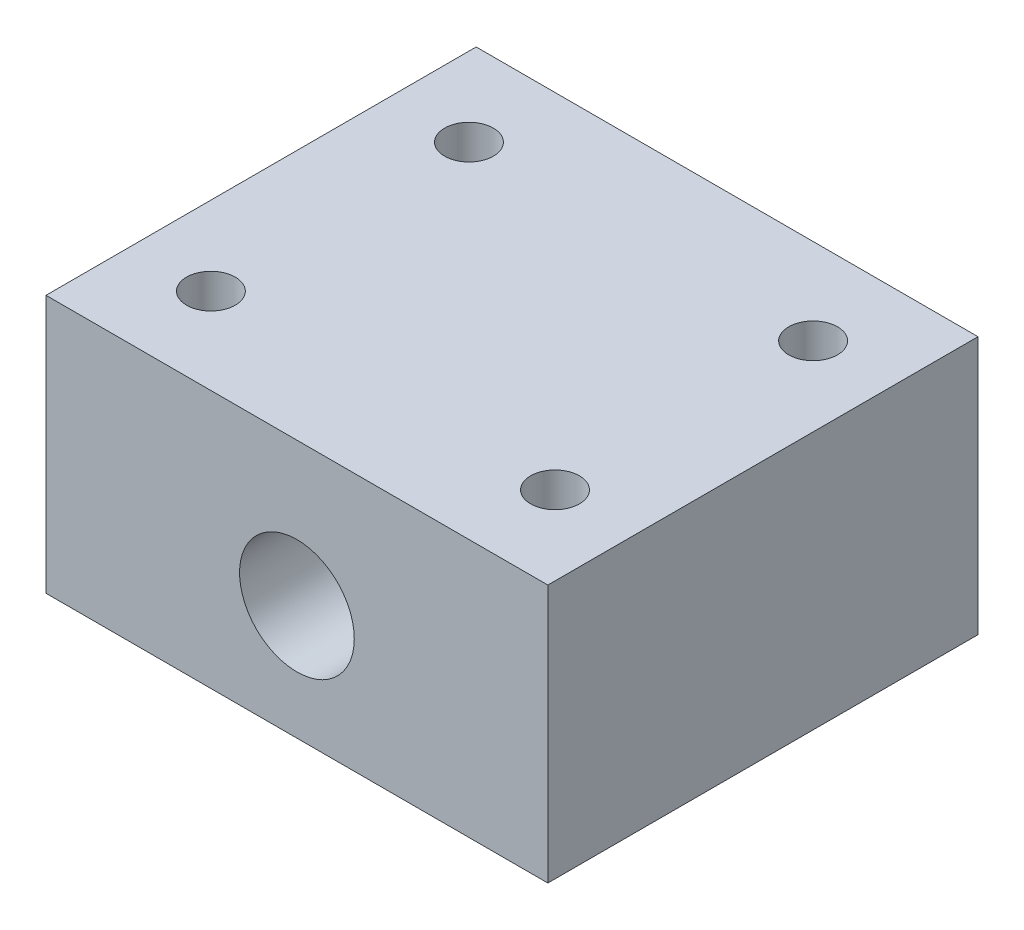
ISO-10303-21;
HEADER;
FILE_DESCRIPTION(('STEP AP214'),'2;1');
FILE_NAME('part.step','',(''),(''),'','','');
FILE_SCHEMA(('AUTOMOTIVE_DESIGN { 1 0 10303 214 1 1 1 1 }'));
ENDSEC;
DATA;
#1=APPLICATION_CONTEXT('core data for automotive mechanical design processes');
#2=APPLICATION_PROTOCOL_DEFINITION('international standard','automotive_design',2000,#1);
#3=PRODUCT_CONTEXT('',#1,'mechanical');
#4=PRODUCT('Part','Part','',(#3));
#5=PRODUCT_RELATED_PRODUCT_CATEGORY('part','',(#4));
#6=PRODUCT_DEFINITION_FORMATION('','',#4);
#7=PRODUCT_DEFINITION_CONTEXT('part definition',#1,'design');
#8=PRODUCT_DEFINITION('design','',#6,#7);
#9=PRODUCT_DEFINITION_SHAPE('','',#8);
#10=(LENGTH_UNIT() NAMED_UNIT(*) SI_UNIT(.MILLI.,.METRE.));
#11=(NAMED_UNIT(*) PLANE_ANGLE_UNIT() SI_UNIT($,.RADIAN.));
#12=(NAMED_UNIT(*) SI_UNIT($,.STERADIAN.) SOLID_ANGLE_UNIT());
#13=UNCERTAINTY_MEASURE_WITH_UNIT(LENGTH_MEASURE(1.E-05),#10,'distance_accuracy_value','');
#14=(GEOMETRIC_REPRESENTATION_CONTEXT(3) GLOBAL_UNCERTAINTY_ASSIGNED_CONTEXT((#13)) GLOBAL_UNIT_ASSIGNED_CONTEXT((#10,
#11,#12)) REPRESENTATION_CONTEXT('',''));
#15=CARTESIAN_POINT('',(0.,0.,0.));
#16=DIRECTION('',(0.,0.,1.));
#17=DIRECTION('',(1.,0.,0.));
#18=AXIS2_PLACEMENT_3D('',#15,#16,#17);
#19=CARTESIAN_POINT('',(0.,18.,0.));
#20=DIRECTION('',(1.,0.,0.));
#21=DIRECTION('',(0.,0.,-1.));
#22=AXIS2_PLACEMENT_3D('',#19,#20,#21);
#23=PLANE('',#22);
#24=DIRECTION('',(0.,0.,1.));
#25=VECTOR('',#24,1.);
#26=CARTESIAN_POINT('',(0.,0.,0.));
#27=LINE('',#26,#25);
#28=CARTESIAN_POINT('',(0.,0.,-30.));
#29=VERTEX_POINT('',#28);
#30=CARTESIAN_POINT('',(0.,0.,0.));
#31=VERTEX_POINT('',#30);
#32=EDGE_CURVE('E96',#29,#31,#27,.T.);
#33=ORIENTED_EDGE('',*,*,#32,.T.);
#34=DIRECTION('',(0.,-1.,0.));
#35=VECTOR('',#34,1.);
#36=CARTESIAN_POINT('',(0.,18.,0.));
#37=LINE('',#36,#35);
#38=CARTESIAN_POINT('',(0.,18.,0.));
#39=VERTEX_POINT('',#38);
#40=EDGE_CURVE('E11',#39,#31,#37,.T.);
#41=ORIENTED_EDGE('',*,*,#40,.F.);
#42=DIRECTION('',(0.,0.,1.));
#43=VECTOR('',#42,1.);
#44=CARTESIAN_POINT('',(0.,18.,0.));
#45=LINE('',#44,#43);
#46=CARTESIAN_POINT('',(0.,18.,-30.));
#47=VERTEX_POINT('',#46);
#48=EDGE_CURVE('E84',#47,#39,#45,.T.);
#49=ORIENTED_EDGE('',*,*,#48,.F.);
#50=DIRECTION('',(0.,-1.,0.));
#51=VECTOR('',#50,1.);
#52=CARTESIAN_POINT('',(0.,18.,-30.));
#53=LINE('',#52,#51);
#54=EDGE_CURVE('E92',#47,#29,#53,.T.);
#55=ORIENTED_EDGE('',*,*,#54,.T.);
#56=EDGE_LOOP('',(#33,#41,#49,#55));
#57=FACE_BOUND('',#56,.T.);
#58=ADVANCED_FACE('F33',(#57),#23,.F.);
#59=CARTESIAN_POINT('',(0.,18.,0.));
#60=DIRECTION('',(0.,0.,-1.));
#61=DIRECTION('',(-1.,0.,0.));
#62=AXIS2_PLACEMENT_3D('',#59,#60,#61);
#63=PLANE('',#62);
#64=CARTESIAN_POINT('',(17.5,8.,0.));
#65=DIRECTION('',(0.,0.,1.));
#66=DIRECTION('',(1.,0.,0.));
#67=AXIS2_PLACEMENT_3D('',#64,#65,#66);
#68=CIRCLE('',#67,4.);
#69=CARTESIAN_POINT('',(21.5,8.,0.));
#70=VERTEX_POINT('',#69);
#71=EDGE_CURVE('E134',#70,#70,#68,.T.);
#72=ORIENTED_EDGE('',*,*,#71,.F.);
#73=EDGE_LOOP('',(#72));
#74=FACE_BOUND('',#73,.T.);
#75=DIRECTION('',(1.,0.,0.));
#76=VECTOR('',#75,1.);
#77=CARTESIAN_POINT('',(0.,0.,0.));
#78=LINE('',#77,#76);
#79=CARTESIAN_POINT('',(35.,0.,0.));
#80=VERTEX_POINT('',#79);
#81=EDGE_CURVE('E88',#31,#80,#78,.T.);
#82=ORIENTED_EDGE('',*,*,#81,.T.);
#83=DIRECTION('',(0.,-1.,0.));
#84=VECTOR('',#83,1.);
#85=CARTESIAN_POINT('',(35.,18.,0.));
#86=LINE('',#85,#84);
#87=CARTESIAN_POINT('',(35.,18.,0.));
#88=VERTEX_POINT('',#87);
#89=EDGE_CURVE('E41',#88,#80,#86,.T.);
#90=ORIENTED_EDGE('',*,*,#89,.F.);
#91=DIRECTION('',(1.,0.,0.));
#92=VECTOR('',#91,1.);
#93=CARTESIAN_POINT('',(0.,18.,0.));
#94=LINE('',#93,#92);
#95=EDGE_CURVE('E79',#39,#88,#94,.T.);
#96=ORIENTED_EDGE('',*,*,#95,.F.);
#97=ORIENTED_EDGE('',*,*,#40,.T.);
#98=EDGE_LOOP('',(#82,#90,#96,#97));
#99=FACE_BOUND('',#98,.T.);
#100=ADVANCED_FACE('F87',(#74,#99),#63,.F.);
#101=CARTESIAN_POINT('',(35.,18.,0.));
#102=DIRECTION('',(-1.,0.,0.));
#103=DIRECTION('',(0.,0.,1.));
#104=AXIS2_PLACEMENT_3D('',#101,#102,#103);
#105=PLANE('',#104);
#106=DIRECTION('',(0.,0.,-1.));
#107=VECTOR('',#106,1.);
#108=CARTESIAN_POINT('',(35.,0.,0.));
#109=LINE('',#108,#107);
#110=CARTESIAN_POINT('',(35.,0.,-30.));
#111=VERTEX_POINT('',#110);
#112=EDGE_CURVE('E66',#80,#111,#109,.T.);
#113=ORIENTED_EDGE('',*,*,#112,.T.);
#114=DIRECTION('',(0.,-1.,0.));
#115=VECTOR('',#114,1.);
#116=CARTESIAN_POINT('',(35.,18.,-30.));
#117=LINE('',#116,#115);
#118=CARTESIAN_POINT('',(35.,18.,-30.));
#119=VERTEX_POINT('',#118);
#120=EDGE_CURVE('E89',#119,#111,#117,.T.);
#121=ORIENTED_EDGE('',*,*,#120,.F.);
#122=DIRECTION('',(0.,0.,-1.));
#123=VECTOR('',#122,1.);
#124=CARTESIAN_POINT('',(35.,18.,0.));
#125=LINE('',#124,#123);
#126=EDGE_CURVE('E82',#88,#119,#125,.T.);
#127=ORIENTED_EDGE('',*,*,#126,.F.);
#128=ORIENTED_EDGE('',*,*,#89,.T.);
#129=EDGE_LOOP('',(#113,#121,#127,#128));
#130=FACE_BOUND('',#129,.T.);
#131=ADVANCED_FACE('F90',(#130),#105,.F.);
#132=CARTESIAN_POINT('',(0.,18.,-30.));
#133=DIRECTION('',(0.,0.,1.));
#134=DIRECTION('',(1.,0.,0.));
#135=AXIS2_PLACEMENT_3D('',#132,#133,#134);
#136=PLANE('',#135);
#137=CARTESIAN_POINT('',(17.5,8.,-30.));
#138=DIRECTION('',(0.,0.,1.));
#139=DIRECTION('',(1.,0.,0.));
#140=AXIS2_PLACEMENT_3D('',#137,#138,#139);
#141=CIRCLE('',#140,4.);
#142=CARTESIAN_POINT('',(21.5,8.,-30.));
#143=VERTEX_POINT('',#142);
#144=EDGE_CURVE('E120',#143,#143,#141,.T.);
#145=ORIENTED_EDGE('',*,*,#144,.T.);
#146=EDGE_LOOP('',(#145));
#147=FACE_BOUND('',#146,.T.);
#148=DIRECTION('',(-1.,0.,0.));
#149=VECTOR('',#148,1.);
#150=CARTESIAN_POINT('',(0.,0.,-30.));
#151=LINE('',#150,#149);
#152=EDGE_CURVE('E72',#111,#29,#151,.T.);
#153=ORIENTED_EDGE('',*,*,#152,.T.);
#154=ORIENTED_EDGE('',*,*,#54,.F.);
#155=DIRECTION('',(-1.,0.,0.));
#156=VECTOR('',#155,1.);
#157=CARTESIAN_POINT('',(0.,18.,-30.));
#158=LINE('',#157,#156);
#159=EDGE_CURVE('E49',#119,#47,#158,.T.);
#160=ORIENTED_EDGE('',*,*,#159,.F.);
#161=ORIENTED_EDGE('',*,*,#120,.T.);
#162=EDGE_LOOP('',(#153,#154,#160,#161));
#163=FACE_BOUND('',#162,.T.);
#164=ADVANCED_FACE('F104',(#147,#163),#136,.F.);
#165=CARTESIAN_POINT('',(0.,18.,0.));
#166=DIRECTION('',(0.,-1.,0.));
#167=DIRECTION('',(0.,0.,-1.));
#168=AXIS2_PLACEMENT_3D('',#165,#166,#167);
#169=PLANE('',#168);
#170=CARTESIAN_POINT('',(5.49999999999999,18.,-6.));
#171=DIRECTION('',(0.,-1.,0.));
#172=DIRECTION('',(0.,0.,1.));
#173=AXIS2_PLACEMENT_3D('',#170,#171,#172);
#174=CIRCLE('',#173,1.7);
#175=CARTESIAN_POINT('',(5.49999999999999,18.,-4.3));
#176=VERTEX_POINT('',#175);
#177=EDGE_CURVE('E119',#176,#176,#174,.T.);
#178=ORIENTED_EDGE('',*,*,#177,.T.);
#179=EDGE_LOOP('',(#178));
#180=FACE_BOUND('',#179,.T.);
#181=CARTESIAN_POINT('',(29.5,18.,-5.99999999999999));
#182=DIRECTION('',(0.,-1.,0.));
#183=DIRECTION('',(0.,0.,-1.));
#184=AXIS2_PLACEMENT_3D('',#181,#182,#183);
#185=CIRCLE('',#184,1.7);
#186=CARTESIAN_POINT('',(29.5,18.,-7.69999999999999));
#187=VERTEX_POINT('',#186);
#188=EDGE_CURVE('E126',#187,#187,#185,.T.);
#189=ORIENTED_EDGE('',*,*,#188,.T.);
#190=EDGE_LOOP('',(#189));
#191=FACE_BOUND('',#190,.T.);
#192=CARTESIAN_POINT('',(29.5,18.,-24.));
#193=DIRECTION('',(0.,-1.,0.));
#194=DIRECTION('',(0.,0.,1.));
#195=AXIS2_PLACEMENT_3D('',#192,#193,#194);
#196=CIRCLE('',#195,1.7);
#197=CARTESIAN_POINT('',(29.5,18.,-22.3));
#198=VERTEX_POINT('',#197);
#199=EDGE_CURVE('E113',#198,#198,#196,.T.);
#200=ORIENTED_EDGE('',*,*,#199,.T.);
#201=EDGE_LOOP('',(#200));
#202=FACE_BOUND('',#201,.T.);
#203=CARTESIAN_POINT('',(5.49999999999999,18.,-24.));
#204=DIRECTION('',(0.,-1.,0.));
#205=DIRECTION('',(0.,0.,-1.));
#206=AXIS2_PLACEMENT_3D('',#203,#204,#205);
#207=CIRCLE('',#206,1.7);
#208=CARTESIAN_POINT('',(5.49999999999999,18.,-25.7));
#209=VERTEX_POINT('',#208);
#210=EDGE_CURVE('E99',#209,#209,#207,.T.);
#211=ORIENTED_EDGE('',*,*,#210,.T.);
#212=EDGE_LOOP('',(#211));
#213=FACE_BOUND('',#212,.T.);
#214=ORIENTED_EDGE('',*,*,#48,.T.);
#215=ORIENTED_EDGE('',*,*,#95,.T.);
#216=ORIENTED_EDGE('',*,*,#126,.T.);
#217=ORIENTED_EDGE('',*,*,#159,.T.);
#218=EDGE_LOOP('',(#214,#215,#216,#217));
#219=FACE_BOUND('',#218,.T.);
#220=ADVANCED_FACE('F80',(#180,#191,#202,#213,#219),#169,.F.);
#221=CARTESIAN_POINT('',(0.,0.,0.));
#222=DIRECTION('',(0.,-1.,0.));
#223=DIRECTION('',(0.,0.,-1.));
#224=AXIS2_PLACEMENT_3D('',#221,#222,#223);
#225=PLANE('',#224);
#226=CARTESIAN_POINT('',(5.49999999999999,0.,-6.));
#227=DIRECTION('',(0.,-1.,0.));
#228=DIRECTION('',(0.,0.,1.));
#229=AXIS2_PLACEMENT_3D('',#226,#227,#228);
#230=CIRCLE('',#229,1.7);
#231=CARTESIAN_POINT('',(5.49999999999999,0.,-4.3));
#232=VERTEX_POINT('',#231);
#233=EDGE_CURVE('E116',#232,#232,#230,.T.);
#234=ORIENTED_EDGE('',*,*,#233,.F.);
#235=EDGE_LOOP('',(#234));
#236=FACE_BOUND('',#235,.T.);
#237=CARTESIAN_POINT('',(29.5,0.,-5.99999999999999));
#238=DIRECTION('',(0.,-1.,0.));
#239=DIRECTION('',(0.,0.,-1.));
#240=AXIS2_PLACEMENT_3D('',#237,#238,#239);
#241=CIRCLE('',#240,1.7);
#242=CARTESIAN_POINT('',(29.5,0.,-7.69999999999999));
#243=VERTEX_POINT('',#242);
#244=EDGE_CURVE('E123',#243,#243,#241,.T.);
#245=ORIENTED_EDGE('',*,*,#244,.F.);
#246=EDGE_LOOP('',(#245));
#247=FACE_BOUND('',#246,.T.);
#248=CARTESIAN_POINT('',(29.5,0.,-24.));
#249=DIRECTION('',(0.,-1.,0.));
#250=DIRECTION('',(0.,0.,1.));
#251=AXIS2_PLACEMENT_3D('',#248,#249,#250);
#252=CIRCLE('',#251,1.7);
#253=CARTESIAN_POINT('',(29.5,0.,-22.3));
#254=VERTEX_POINT('',#253);
#255=EDGE_CURVE('E129',#254,#254,#252,.T.);
#256=ORIENTED_EDGE('',*,*,#255,.F.);
#257=EDGE_LOOP('',(#256));
#258=FACE_BOUND('',#257,.T.);
#259=CARTESIAN_POINT('',(5.49999999999999,0.,-24.));
#260=DIRECTION('',(0.,-1.,0.));
#261=DIRECTION('',(0.,0.,-1.));
#262=AXIS2_PLACEMENT_3D('',#259,#260,#261);
#263=CIRCLE('',#262,1.7);
#264=CARTESIAN_POINT('',(5.49999999999999,0.,-25.7));
#265=VERTEX_POINT('',#264);
#266=EDGE_CURVE('E110',#265,#265,#263,.T.);
#267=ORIENTED_EDGE('',*,*,#266,.F.);
#268=EDGE_LOOP('',(#267));
#269=FACE_BOUND('',#268,.T.);
#270=ORIENTED_EDGE('',*,*,#32,.F.);
#271=ORIENTED_EDGE('',*,*,#152,.F.);
#272=ORIENTED_EDGE('',*,*,#112,.F.);
#273=ORIENTED_EDGE('',*,*,#81,.F.);
#274=EDGE_LOOP('',(#270,#271,#272,#273));
#275=FACE_BOUND('',#274,.T.);
#276=ADVANCED_FACE('F107',(#236,#247,#258,#269,#275),#225,.T.);
#277=CARTESIAN_POINT('',(5.49999999999999,18.,-24.));
#278=DIRECTION('',(0.,-1.,0.));
#279=DIRECTION('',(0.,0.,-1.));
#280=AXIS2_PLACEMENT_3D('',#277,#278,#279);
#281=CYLINDRICAL_SURFACE('',#280,1.7);
#282=ORIENTED_EDGE('',*,*,#210,.F.);
#283=EDGE_LOOP('',(#282));
#284=FACE_BOUND('',#283,.T.);
#285=ORIENTED_EDGE('',*,*,#266,.T.);
#286=EDGE_LOOP('',(#285));
#287=FACE_BOUND('',#286,.T.);
#288=ADVANCED_FACE('F159',(#284,#287),#281,.F.);
#289=CARTESIAN_POINT('',(29.5,18.,-24.));
#290=DIRECTION('',(0.,-1.,0.));
#291=DIRECTION('',(0.,0.,-1.));
#292=AXIS2_PLACEMENT_3D('',#289,#290,#291);
#293=CYLINDRICAL_SURFACE('',#292,1.7);
#294=ORIENTED_EDGE('',*,*,#199,.F.);
#295=EDGE_LOOP('',(#294));
#296=FACE_BOUND('',#295,.T.);
#297=ORIENTED_EDGE('',*,*,#255,.T.);
#298=EDGE_LOOP('',(#297));
#299=FACE_BOUND('',#298,.T.);
#300=ADVANCED_FACE('F166',(#296,#299),#293,.F.);
#301=CARTESIAN_POINT('',(29.5,18.,-5.99999999999999));
#302=DIRECTION('',(0.,-1.,0.));
#303=DIRECTION('',(0.,0.,-1.));
#304=AXIS2_PLACEMENT_3D('',#301,#302,#303);
#305=CYLINDRICAL_SURFACE('',#304,1.7);
#306=ORIENTED_EDGE('',*,*,#188,.F.);
#307=EDGE_LOOP('',(#306));
#308=FACE_BOUND('',#307,.T.);
#309=ORIENTED_EDGE('',*,*,#244,.T.);
#310=EDGE_LOOP('',(#309));
#311=FACE_BOUND('',#310,.T.);
#312=ADVANCED_FACE('F170',(#308,#311),#305,.F.);
#313=CARTESIAN_POINT('',(5.49999999999999,18.,-6.));
#314=DIRECTION('',(0.,-1.,0.));
#315=DIRECTION('',(0.,0.,-1.));
#316=AXIS2_PLACEMENT_3D('',#313,#314,#315);
#317=CYLINDRICAL_SURFACE('',#316,1.7);
#318=ORIENTED_EDGE('',*,*,#177,.F.);
#319=EDGE_LOOP('',(#318));
#320=FACE_BOUND('',#319,.T.);
#321=ORIENTED_EDGE('',*,*,#233,.T.);
#322=EDGE_LOOP('',(#321));
#323=FACE_BOUND('',#322,.T.);
#324=ADVANCED_FACE('F144',(#320,#323),#317,.F.);
#325=CARTESIAN_POINT('',(17.5,8.,-30.));
#326=DIRECTION('',(0.,0.,1.));
#327=DIRECTION('',(1.,0.,0.));
#328=AXIS2_PLACEMENT_3D('',#325,#326,#327);
#329=CYLINDRICAL_SURFACE('',#328,4.);
#330=ORIENTED_EDGE('',*,*,#144,.F.);
#331=EDGE_LOOP('',(#330));
#332=FACE_BOUND('',#331,.T.);
#333=ORIENTED_EDGE('',*,*,#71,.T.);
#334=EDGE_LOOP('',(#333));
#335=FACE_BOUND('',#334,.T.);
#336=ADVANCED_FACE('F141',(#332,#335),#329,.F.);
#337=CLOSED_SHELL('',(#58,#100,#131,#164,#220,#276,#288,#300,#312,#324,#336));
#338=MANIFOLD_SOLID_BREP('B2',#337);
#339=ADVANCED_BREP_SHAPE_REPRESENTATION('',(#18,#338),#14);
#340=SHAPE_DEFINITION_REPRESENTATION(#9,#339);
ENDSEC;
END-ISO-10303-21;
